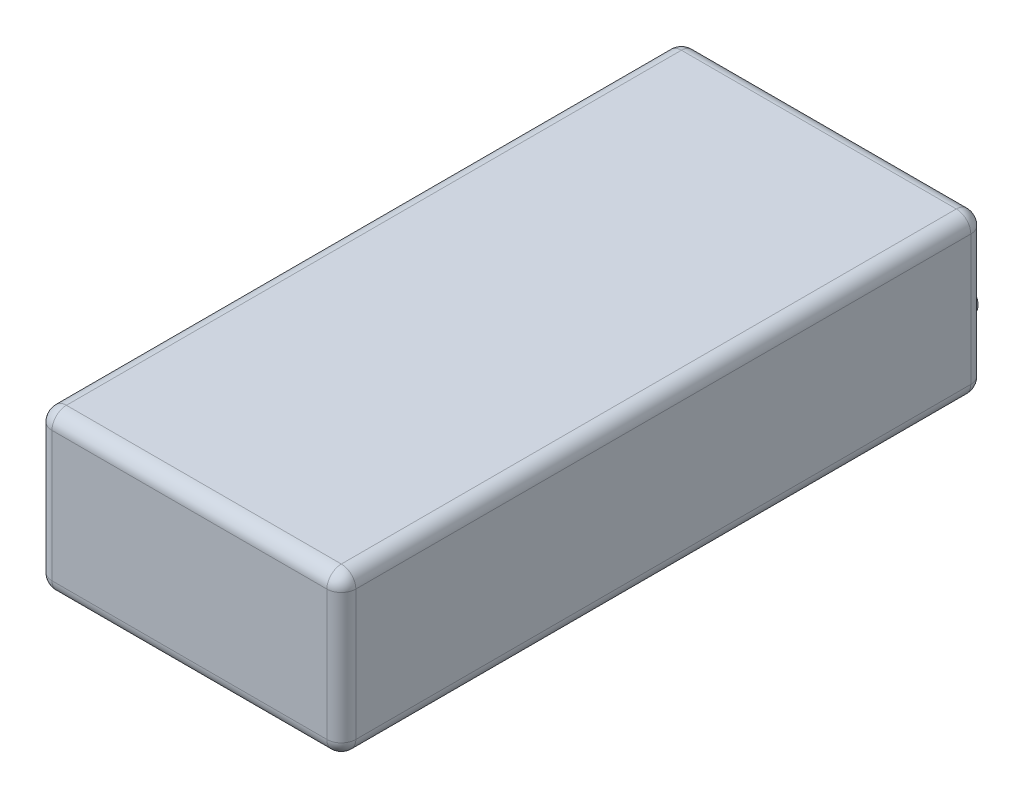
ISO-10303-21;
HEADER;
FILE_DESCRIPTION(('STEP AP214'),'2;1');
FILE_NAME('part.step','',(''),(''),'','','');
FILE_SCHEMA(('AUTOMOTIVE_DESIGN { 1 0 10303 214 1 1 1 1 }'));
ENDSEC;
DATA;
#1=APPLICATION_CONTEXT('core data for automotive mechanical design processes');
#2=APPLICATION_PROTOCOL_DEFINITION('international standard','automotive_design',2000,#1);
#3=PRODUCT_CONTEXT('',#1,'mechanical');
#4=PRODUCT('Part','Part','',(#3));
#5=PRODUCT_RELATED_PRODUCT_CATEGORY('part','',(#4));
#6=PRODUCT_DEFINITION_FORMATION('','',#4);
#7=PRODUCT_DEFINITION_CONTEXT('part definition',#1,'design');
#8=PRODUCT_DEFINITION('design','',#6,#7);
#9=PRODUCT_DEFINITION_SHAPE('','',#8);
#10=(LENGTH_UNIT() NAMED_UNIT(*) SI_UNIT(.MILLI.,.METRE.));
#11=(NAMED_UNIT(*) PLANE_ANGLE_UNIT() SI_UNIT($,.RADIAN.));
#12=(NAMED_UNIT(*) SI_UNIT($,.STERADIAN.) SOLID_ANGLE_UNIT());
#13=UNCERTAINTY_MEASURE_WITH_UNIT(LENGTH_MEASURE(1.E-05),#10,'distance_accuracy_value','');
#14=(GEOMETRIC_REPRESENTATION_CONTEXT(3) GLOBAL_UNCERTAINTY_ASSIGNED_CONTEXT((#13)) GLOBAL_UNIT_ASSIGNED_CONTEXT((#10,
#11,#12)) REPRESENTATION_CONTEXT('',''));
#15=CARTESIAN_POINT('',(0.,0.,0.));
#16=DIRECTION('',(0.,0.,1.));
#17=DIRECTION('',(1.,0.,0.));
#18=AXIS2_PLACEMENT_3D('',#15,#16,#17);
#19=CARTESIAN_POINT('',(-21.,-11.,-44.5));
#20=DIRECTION('',(0.,0.,-1.));
#21=DIRECTION('',(-1.,0.,0.));
#22=AXIS2_PLACEMENT_3D('',#19,#20,#21);
#23=PLANE('',#22);
#24=DIRECTION('',(0.,1.,0.));
#25=VECTOR('',#24,1.);
#26=CARTESIAN_POINT('',(-19.,-11.,-44.5));
#27=LINE('',#26,#25);
#28=CARTESIAN_POINT('',(-19.,-9.,-44.5));
#29=VERTEX_POINT('',#28);
#30=CARTESIAN_POINT('',(-19.,9.,-44.5));
#31=VERTEX_POINT('',#30);
#32=EDGE_CURVE('E205',#29,#31,#27,.T.);
#33=ORIENTED_EDGE('',*,*,#32,.T.);
#34=DIRECTION('',(-1.,0.,0.));
#35=VECTOR('',#34,1.);
#36=CARTESIAN_POINT('',(21.,9.,-44.5));
#37=LINE('',#36,#35);
#38=CARTESIAN_POINT('',(19.,9.,-44.5));
#39=VERTEX_POINT('',#38);
#40=EDGE_CURVE('E208',#31,#39,#37,.F.);
#41=ORIENTED_EDGE('',*,*,#40,.T.);
#42=DIRECTION('',(0.,1.,0.));
#43=VECTOR('',#42,1.);
#44=CARTESIAN_POINT('',(19.,-11.,-44.5));
#45=LINE('',#44,#43);
#46=CARTESIAN_POINT('',(19.,-9.,-44.5));
#47=VERTEX_POINT('',#46);
#48=EDGE_CURVE('E203',#39,#47,#45,.F.);
#49=ORIENTED_EDGE('',*,*,#48,.T.);
#50=DIRECTION('',(-1.,0.,0.));
#51=VECTOR('',#50,1.);
#52=CARTESIAN_POINT('',(-21.,-9.,-44.5));
#53=LINE('',#52,#51);
#54=EDGE_CURVE('E201',#47,#29,#53,.T.);
#55=ORIENTED_EDGE('',*,*,#54,.T.);
#56=EDGE_LOOP('',(#33,#41,#49,#55));
#57=FACE_BOUND('',#56,.T.);
#58=CARTESIAN_POINT('',(13.,-6.,-44.5));
#59=DIRECTION('',(0.,0.,-1.));
#60=DIRECTION('',(-1.,0.,0.));
#61=AXIS2_PLACEMENT_3D('',#58,#59,#60);
#62=CIRCLE('',#61,2.);
#63=CARTESIAN_POINT('',(11.,-6.,-44.5));
#64=VERTEX_POINT('',#63);
#65=EDGE_CURVE('E317',#64,#64,#62,.T.);
#66=ORIENTED_EDGE('',*,*,#65,.F.);
#67=EDGE_LOOP('',(#66));
#68=FACE_BOUND('',#67,.T.);
#69=DIRECTION('',(1.,0.,0.));
#70=VECTOR('',#69,1.);
#71=CARTESIAN_POINT('',(-5.5,3.5,-44.5));
#72=LINE('',#71,#70);
#73=CARTESIAN_POINT('',(-12.5,3.5,-44.5));
#74=VERTEX_POINT('',#73);
#75=CARTESIAN_POINT('',(-5.5,3.5,-44.5));
#76=VERTEX_POINT('',#75);
#77=EDGE_CURVE('E331',#74,#76,#72,.T.);
#78=ORIENTED_EDGE('',*,*,#77,.F.);
#79=DIRECTION('',(0.,1.,0.));
#80=VECTOR('',#79,1.);
#81=CARTESIAN_POINT('',(-12.5,-1.5,-44.5));
#82=LINE('',#81,#80);
#83=CARTESIAN_POINT('',(-12.5,-1.5,-44.5));
#84=VERTEX_POINT('',#83);
#85=EDGE_CURVE('E176',#84,#74,#82,.T.);
#86=ORIENTED_EDGE('',*,*,#85,.F.);
#87=DIRECTION('',(-1.,0.,0.));
#88=VECTOR('',#87,1.);
#89=CARTESIAN_POINT('',(-5.5,-1.5,-44.5));
#90=LINE('',#89,#88);
#91=CARTESIAN_POINT('',(-5.5,-1.5,-44.5));
#92=VERTEX_POINT('',#91);
#93=EDGE_CURVE('E172',#92,#84,#90,.T.);
#94=ORIENTED_EDGE('',*,*,#93,.F.);
#95=DIRECTION('',(0.,-1.,0.));
#96=VECTOR('',#95,1.);
#97=CARTESIAN_POINT('',(-5.5,-1.5,-44.5));
#98=LINE('',#97,#96);
#99=EDGE_CURVE('E333',#76,#92,#98,.T.);
#100=ORIENTED_EDGE('',*,*,#99,.F.);
#101=EDGE_LOOP('',(#78,#86,#94,#100));
#102=FACE_BOUND('',#101,.T.);
#103=ADVANCED_FACE('F41',(#57,#68,#102),#23,.T.);
#104=CARTESIAN_POINT('',(21.,-11.,44.5));
#105=DIRECTION('',(1.,0.,0.));
#106=DIRECTION('',(0.,0.,-1.));
#107=AXIS2_PLACEMENT_3D('',#104,#105,#106);
#108=PLANE('',#107);
#109=DIRECTION('',(0.,1.,0.));
#110=VECTOR('',#109,1.);
#111=CARTESIAN_POINT('',(21.,-11.,42.5));
#112=LINE('',#111,#110);
#113=CARTESIAN_POINT('',(21.,9.,42.5));
#114=VERTEX_POINT('',#113);
#115=CARTESIAN_POINT('',(21.,-9.,42.5));
#116=VERTEX_POINT('',#115);
#117=EDGE_CURVE('E212',#114,#116,#112,.F.);
#118=ORIENTED_EDGE('',*,*,#117,.T.);
#119=DIRECTION('',(0.,0.,-1.));
#120=VECTOR('',#119,1.);
#121=CARTESIAN_POINT('',(21.,-9.,44.5));
#122=LINE('',#121,#120);
#123=CARTESIAN_POINT('',(21.,-9.,-42.5));
#124=VERTEX_POINT('',#123);
#125=EDGE_CURVE('E216',#116,#124,#122,.T.);
#126=ORIENTED_EDGE('',*,*,#125,.T.);
#127=DIRECTION('',(0.,1.,0.));
#128=VECTOR('',#127,1.);
#129=CARTESIAN_POINT('',(21.,-11.,-42.5));
#130=LINE('',#129,#128);
#131=CARTESIAN_POINT('',(21.,9.,-42.5));
#132=VERTEX_POINT('',#131);
#133=EDGE_CURVE('E214',#124,#132,#130,.T.);
#134=ORIENTED_EDGE('',*,*,#133,.T.);
#135=DIRECTION('',(0.,0.,-1.));
#136=VECTOR('',#135,1.);
#137=CARTESIAN_POINT('',(21.,9.,44.5));
#138=LINE('',#137,#136);
#139=EDGE_CURVE('E210',#132,#114,#138,.F.);
#140=ORIENTED_EDGE('',*,*,#139,.T.);
#141=EDGE_LOOP('',(#118,#126,#134,#140));
#142=FACE_BOUND('',#141,.T.);
#143=ADVANCED_FACE('F346',(#142),#108,.T.);
#144=CARTESIAN_POINT('',(-21.,-11.,44.5));
#145=DIRECTION('',(0.,0.,1.));
#146=DIRECTION('',(1.,0.,0.));
#147=AXIS2_PLACEMENT_3D('',#144,#145,#146);
#148=PLANE('',#147);
#149=DIRECTION('',(0.,1.,0.));
#150=VECTOR('',#149,1.);
#151=CARTESIAN_POINT('',(-19.,-11.,44.5));
#152=LINE('',#151,#150);
#153=CARTESIAN_POINT('',(-19.,9.,44.5));
#154=VERTEX_POINT('',#153);
#155=CARTESIAN_POINT('',(-19.,-9.,44.5));
#156=VERTEX_POINT('',#155);
#157=EDGE_CURVE('E223',#154,#156,#152,.F.);
#158=ORIENTED_EDGE('',*,*,#157,.T.);
#159=DIRECTION('',(1.,0.,0.));
#160=VECTOR('',#159,1.);
#161=CARTESIAN_POINT('',(-21.,-9.,44.5));
#162=LINE('',#161,#160);
#163=CARTESIAN_POINT('',(19.,-9.,44.5));
#164=VERTEX_POINT('',#163);
#165=EDGE_CURVE('E225',#156,#164,#162,.T.);
#166=ORIENTED_EDGE('',*,*,#165,.T.);
#167=DIRECTION('',(0.,1.,0.));
#168=VECTOR('',#167,1.);
#169=CARTESIAN_POINT('',(19.,-11.,44.5));
#170=LINE('',#169,#168);
#171=CARTESIAN_POINT('',(19.,9.,44.5));
#172=VERTEX_POINT('',#171);
#173=EDGE_CURVE('E221',#164,#172,#170,.T.);
#174=ORIENTED_EDGE('',*,*,#173,.T.);
#175=DIRECTION('',(1.,0.,0.));
#176=VECTOR('',#175,1.);
#177=CARTESIAN_POINT('',(-21.,9.,44.5));
#178=LINE('',#177,#176);
#179=EDGE_CURVE('E219',#172,#154,#178,.F.);
#180=ORIENTED_EDGE('',*,*,#179,.T.);
#181=EDGE_LOOP('',(#158,#166,#174,#180));
#182=FACE_BOUND('',#181,.T.);
#183=ADVANCED_FACE('F352',(#182),#148,.T.);
#184=CARTESIAN_POINT('',(-21.,-11.,44.5));
#185=DIRECTION('',(-1.,0.,0.));
#186=DIRECTION('',(0.,0.,1.));
#187=AXIS2_PLACEMENT_3D('',#184,#185,#186);
#188=PLANE('',#187);
#189=DIRECTION('',(0.,1.,0.));
#190=VECTOR('',#189,1.);
#191=CARTESIAN_POINT('',(-21.,-11.,-42.5));
#192=LINE('',#191,#190);
#193=CARTESIAN_POINT('',(-21.,9.,-42.5));
#194=VERTEX_POINT('',#193);
#195=CARTESIAN_POINT('',(-21.,-9.,-42.5));
#196=VERTEX_POINT('',#195);
#197=EDGE_CURVE('E187',#194,#196,#192,.F.);
#198=ORIENTED_EDGE('',*,*,#197,.T.);
#199=DIRECTION('',(0.,0.,1.));
#200=VECTOR('',#199,1.);
#201=CARTESIAN_POINT('',(-21.,-9.,44.5));
#202=LINE('',#201,#200);
#203=CARTESIAN_POINT('',(-21.,-9.,42.5));
#204=VERTEX_POINT('',#203);
#205=EDGE_CURVE('E189',#196,#204,#202,.T.);
#206=ORIENTED_EDGE('',*,*,#205,.T.);
#207=DIRECTION('',(0.,1.,0.));
#208=VECTOR('',#207,1.);
#209=CARTESIAN_POINT('',(-21.,-11.,42.5));
#210=LINE('',#209,#208);
#211=CARTESIAN_POINT('',(-21.,9.,42.5));
#212=VERTEX_POINT('',#211);
#213=EDGE_CURVE('E180',#204,#212,#210,.T.);
#214=ORIENTED_EDGE('',*,*,#213,.T.);
#215=DIRECTION('',(0.,0.,1.));
#216=VECTOR('',#215,1.);
#217=CARTESIAN_POINT('',(-21.,9.,-44.5));
#218=LINE('',#217,#216);
#219=EDGE_CURVE('E178',#212,#194,#218,.F.);
#220=ORIENTED_EDGE('',*,*,#219,.T.);
#221=EDGE_LOOP('',(#198,#206,#214,#220));
#222=FACE_BOUND('',#221,.T.);
#223=ADVANCED_FACE('F357',(#222),#188,.T.);
#224=CARTESIAN_POINT('',(0.,-11.,0.));
#225=DIRECTION('',(0.,-1.,0.));
#226=DIRECTION('',(0.,0.,-1.));
#227=AXIS2_PLACEMENT_3D('',#224,#225,#226);
#228=PLANE('',#227);
#229=DIRECTION('',(0.,0.,-1.));
#230=VECTOR('',#229,1.);
#231=CARTESIAN_POINT('',(19.,-11.,0.));
#232=LINE('',#231,#230);
#233=CARTESIAN_POINT('',(19.,-11.,-42.5));
#234=VERTEX_POINT('',#233);
#235=CARTESIAN_POINT('',(19.,-11.,42.5));
#236=VERTEX_POINT('',#235);
#237=EDGE_CURVE('E194',#234,#236,#232,.F.);
#238=ORIENTED_EDGE('',*,*,#237,.T.);
#239=DIRECTION('',(1.,0.,0.));
#240=VECTOR('',#239,1.);
#241=CARTESIAN_POINT('',(0.,-11.,42.5));
#242=LINE('',#241,#240);
#243=CARTESIAN_POINT('',(-19.,-11.,42.5));
#244=VERTEX_POINT('',#243);
#245=EDGE_CURVE('E199',#236,#244,#242,.F.);
#246=ORIENTED_EDGE('',*,*,#245,.T.);
#247=DIRECTION('',(0.,0.,1.));
#248=VECTOR('',#247,1.);
#249=CARTESIAN_POINT('',(-19.,-11.,0.));
#250=LINE('',#249,#248);
#251=CARTESIAN_POINT('',(-19.,-11.,-42.5));
#252=VERTEX_POINT('',#251);
#253=EDGE_CURVE('E196',#244,#252,#250,.F.);
#254=ORIENTED_EDGE('',*,*,#253,.T.);
#255=DIRECTION('',(-1.,0.,0.));
#256=VECTOR('',#255,1.);
#257=CARTESIAN_POINT('',(0.,-11.,-42.5));
#258=LINE('',#257,#256);
#259=EDGE_CURVE('E192',#252,#234,#258,.F.);
#260=ORIENTED_EDGE('',*,*,#259,.T.);
#261=EDGE_LOOP('',(#238,#246,#254,#260));
#262=FACE_BOUND('',#261,.T.);
#263=CARTESIAN_POINT('',(-12.,-11.,25.5));
#264=DIRECTION('',(0.,-1.,0.));
#265=DIRECTION('',(0.,0.,-1.));
#266=AXIS2_PLACEMENT_3D('',#263,#264,#265);
#267=CIRCLE('',#266,2.5);
#268=CARTESIAN_POINT('',(-12.,-11.,23.));
#269=VERTEX_POINT('',#268);
#270=EDGE_CURVE('E486',#269,#269,#267,.T.);
#271=ORIENTED_EDGE('',*,*,#270,.F.);
#272=EDGE_LOOP('',(#271));
#273=FACE_BOUND('',#272,.T.);
#274=CARTESIAN_POINT('',(12.,-11.,-14.5));
#275=DIRECTION('',(0.,-1.,0.));
#276=DIRECTION('',(0.,0.,-1.));
#277=AXIS2_PLACEMENT_3D('',#274,#275,#276);
#278=CIRCLE('',#277,2.5);
#279=CARTESIAN_POINT('',(12.,-11.,-17.));
#280=VERTEX_POINT('',#279);
#281=EDGE_CURVE('E310',#280,#280,#278,.T.);
#282=ORIENTED_EDGE('',*,*,#281,.F.);
#283=EDGE_LOOP('',(#282));
#284=FACE_BOUND('',#283,.T.);
#285=CARTESIAN_POINT('',(-12.,-11.,-14.5));
#286=DIRECTION('',(0.,-1.,0.));
#287=DIRECTION('',(0.,0.,-1.));
#288=AXIS2_PLACEMENT_3D('',#285,#286,#287);
#289=CIRCLE('',#288,2.5);
#290=CARTESIAN_POINT('',(-12.,-11.,-17.));
#291=VERTEX_POINT('',#290);
#292=EDGE_CURVE('E299',#291,#291,#289,.T.);
#293=ORIENTED_EDGE('',*,*,#292,.F.);
#294=EDGE_LOOP('',(#293));
#295=FACE_BOUND('',#294,.T.);
#296=CARTESIAN_POINT('',(12.,-11.,25.5));
#297=DIRECTION('',(0.,-1.,0.));
#298=DIRECTION('',(0.,0.,-1.));
#299=AXIS2_PLACEMENT_3D('',#296,#297,#298);
#300=CIRCLE('',#299,2.5);
#301=CARTESIAN_POINT('',(12.,-11.,23.));
#302=VERTEX_POINT('',#301);
#303=EDGE_CURVE('E318',#302,#302,#300,.T.);
#304=ORIENTED_EDGE('',*,*,#303,.F.);
#305=EDGE_LOOP('',(#304));
#306=FACE_BOUND('',#305,.T.);
#307=ADVANCED_FACE('F479',(#262,#273,#284,#295,#306),#228,.T.);
#308=CARTESIAN_POINT('',(0.,11.,0.));
#309=DIRECTION('',(0.,-1.,0.));
#310=DIRECTION('',(0.,0.,-1.));
#311=AXIS2_PLACEMENT_3D('',#308,#309,#310);
#312=PLANE('',#311);
#313=DIRECTION('',(0.,0.,1.));
#314=VECTOR('',#313,1.);
#315=CARTESIAN_POINT('',(-19.,11.,44.5));
#316=LINE('',#315,#314);
#317=CARTESIAN_POINT('',(-19.,11.,-42.5));
#318=VERTEX_POINT('',#317);
#319=CARTESIAN_POINT('',(-19.,11.,42.5));
#320=VERTEX_POINT('',#319);
#321=EDGE_CURVE('E50',#318,#320,#316,.T.);
#322=ORIENTED_EDGE('',*,*,#321,.T.);
#323=DIRECTION('',(1.,0.,0.));
#324=VECTOR('',#323,1.);
#325=CARTESIAN_POINT('',(21.,11.,42.5));
#326=LINE('',#325,#324);
#327=CARTESIAN_POINT('',(19.,11.,42.5));
#328=VERTEX_POINT('',#327);
#329=EDGE_CURVE('E11',#320,#328,#326,.T.);
#330=ORIENTED_EDGE('',*,*,#329,.T.);
#331=DIRECTION('',(0.,0.,-1.));
#332=VECTOR('',#331,1.);
#333=CARTESIAN_POINT('',(19.,11.,-44.5));
#334=LINE('',#333,#332);
#335=CARTESIAN_POINT('',(19.,11.,-42.5));
#336=VERTEX_POINT('',#335);
#337=EDGE_CURVE('E228',#328,#336,#334,.T.);
#338=ORIENTED_EDGE('',*,*,#337,.T.);
#339=DIRECTION('',(-1.,0.,0.));
#340=VECTOR('',#339,1.);
#341=CARTESIAN_POINT('',(-21.,11.,-42.5));
#342=LINE('',#341,#340);
#343=EDGE_CURVE('E61',#336,#318,#342,.T.);
#344=ORIENTED_EDGE('',*,*,#343,.T.);
#345=EDGE_LOOP('',(#322,#330,#338,#344));
#346=FACE_BOUND('',#345,.T.);
#347=ADVANCED_FACE('F449',(#346),#312,.F.);
#348=CARTESIAN_POINT('',(-12.5,-1.5,-46.5));
#349=DIRECTION('',(1.,0.,0.));
#350=DIRECTION('',(0.,0.,-1.));
#351=AXIS2_PLACEMENT_3D('',#348,#349,#350);
#352=PLANE('',#351);
#353=ORIENTED_EDGE('',*,*,#85,.T.);
#354=DIRECTION('',(0.,0.,1.));
#355=VECTOR('',#354,1.);
#356=CARTESIAN_POINT('',(-12.5,3.5,-46.5));
#357=LINE('',#356,#355);
#358=CARTESIAN_POINT('',(-12.5,3.5,-46.5));
#359=VERTEX_POINT('',#358);
#360=EDGE_CURVE('E156',#359,#74,#357,.T.);
#361=ORIENTED_EDGE('',*,*,#360,.F.);
#362=DIRECTION('',(0.,1.,0.));
#363=VECTOR('',#362,1.);
#364=CARTESIAN_POINT('',(-12.5,-1.5,-46.5));
#365=LINE('',#364,#363);
#366=CARTESIAN_POINT('',(-12.5,-1.5,-46.5));
#367=VERTEX_POINT('',#366);
#368=EDGE_CURVE('E163',#367,#359,#365,.T.);
#369=ORIENTED_EDGE('',*,*,#368,.F.);
#370=DIRECTION('',(0.,0.,1.));
#371=VECTOR('',#370,1.);
#372=CARTESIAN_POINT('',(-12.5,-1.5,-46.5));
#373=LINE('',#372,#371);
#374=EDGE_CURVE('E329',#367,#84,#373,.T.);
#375=ORIENTED_EDGE('',*,*,#374,.T.);
#376=EDGE_LOOP('',(#353,#361,#369,#375));
#377=FACE_BOUND('',#376,.T.);
#378=ADVANCED_FACE('F174',(#377),#352,.F.);
#379=CARTESIAN_POINT('',(-5.5,3.5,-46.5));
#380=DIRECTION('',(0.,-1.,0.));
#381=DIRECTION('',(0.,0.,-1.));
#382=AXIS2_PLACEMENT_3D('',#379,#380,#381);
#383=PLANE('',#382);
#384=ORIENTED_EDGE('',*,*,#77,.T.);
#385=DIRECTION('',(0.,0.,1.));
#386=VECTOR('',#385,1.);
#387=CARTESIAN_POINT('',(-5.5,3.5,-46.5));
#388=LINE('',#387,#386);
#389=CARTESIAN_POINT('',(-5.5,3.5,-46.5));
#390=VERTEX_POINT('',#389);
#391=EDGE_CURVE('E159',#390,#76,#388,.T.);
#392=ORIENTED_EDGE('',*,*,#391,.F.);
#393=DIRECTION('',(1.,0.,0.));
#394=VECTOR('',#393,1.);
#395=CARTESIAN_POINT('',(-5.5,3.5,-46.5));
#396=LINE('',#395,#394);
#397=EDGE_CURVE('E152',#359,#390,#396,.T.);
#398=ORIENTED_EDGE('',*,*,#397,.F.);
#399=ORIENTED_EDGE('',*,*,#360,.T.);
#400=EDGE_LOOP('',(#384,#392,#398,#399));
#401=FACE_BOUND('',#400,.T.);
#402=ADVANCED_FACE('F154',(#401),#383,.F.);
#403=CARTESIAN_POINT('',(-5.5,-1.5,-46.5));
#404=DIRECTION('',(-1.,0.,0.));
#405=DIRECTION('',(0.,0.,1.));
#406=AXIS2_PLACEMENT_3D('',#403,#404,#405);
#407=PLANE('',#406);
#408=ORIENTED_EDGE('',*,*,#99,.T.);
#409=DIRECTION('',(0.,0.,1.));
#410=VECTOR('',#409,1.);
#411=CARTESIAN_POINT('',(-5.5,-1.5,-46.5));
#412=LINE('',#411,#410);
#413=CARTESIAN_POINT('',(-5.5,-1.5,-46.5));
#414=VERTEX_POINT('',#413);
#415=EDGE_CURVE('E182',#414,#92,#412,.T.);
#416=ORIENTED_EDGE('',*,*,#415,.F.);
#417=DIRECTION('',(0.,-1.,0.));
#418=VECTOR('',#417,1.);
#419=CARTESIAN_POINT('',(-5.5,-1.5,-46.5));
#420=LINE('',#419,#418);
#421=EDGE_CURVE('E162',#390,#414,#420,.T.);
#422=ORIENTED_EDGE('',*,*,#421,.F.);
#423=ORIENTED_EDGE('',*,*,#391,.T.);
#424=EDGE_LOOP('',(#408,#416,#422,#423));
#425=FACE_BOUND('',#424,.T.);
#426=ADVANCED_FACE('F343',(#425),#407,.F.);
#427=CARTESIAN_POINT('',(-5.5,-1.5,-46.5));
#428=DIRECTION('',(0.,1.,0.));
#429=DIRECTION('',(0.,0.,1.));
#430=AXIS2_PLACEMENT_3D('',#427,#428,#429);
#431=PLANE('',#430);
#432=ORIENTED_EDGE('',*,*,#93,.T.);
#433=ORIENTED_EDGE('',*,*,#374,.F.);
#434=DIRECTION('',(-1.,0.,0.));
#435=VECTOR('',#434,1.);
#436=CARTESIAN_POINT('',(-5.5,-1.5,-46.5));
#437=LINE('',#436,#435);
#438=EDGE_CURVE('E168',#414,#367,#437,.T.);
#439=ORIENTED_EDGE('',*,*,#438,.F.);
#440=ORIENTED_EDGE('',*,*,#415,.T.);
#441=EDGE_LOOP('',(#432,#433,#439,#440));
#442=FACE_BOUND('',#441,.T.);
#443=ADVANCED_FACE('F339',(#442),#431,.F.);
#444=CARTESIAN_POINT('',(0.,0.,-46.5));
#445=DIRECTION('',(0.,0.,1.));
#446=DIRECTION('',(1.,0.,0.));
#447=AXIS2_PLACEMENT_3D('',#444,#445,#446);
#448=PLANE('',#447);
#449=ORIENTED_EDGE('',*,*,#368,.T.);
#450=ORIENTED_EDGE('',*,*,#397,.T.);
#451=ORIENTED_EDGE('',*,*,#421,.T.);
#452=ORIENTED_EDGE('',*,*,#438,.T.);
#453=EDGE_LOOP('',(#449,#450,#451,#452));
#454=FACE_BOUND('',#453,.T.);
#455=ADVANCED_FACE('F166',(#454),#448,.F.);
#456=CARTESIAN_POINT('',(13.,-6.,-49.5));
#457=DIRECTION('',(0.,0.,1.));
#458=DIRECTION('',(1.,0.,0.));
#459=AXIS2_PLACEMENT_3D('',#456,#457,#458);
#460=CYLINDRICAL_SURFACE('',#459,2.);
#461=CARTESIAN_POINT('',(13.,-6.,-49.5));
#462=DIRECTION('',(0.,0.,-1.));
#463=DIRECTION('',(-1.,0.,0.));
#464=AXIS2_PLACEMENT_3D('',#461,#462,#463);
#465=CIRCLE('',#464,2.);
#466=CARTESIAN_POINT('',(11.,-6.,-49.5));
#467=VERTEX_POINT('',#466);
#468=EDGE_CURVE('E322',#467,#467,#465,.T.);
#469=ORIENTED_EDGE('',*,*,#468,.F.);
#470=EDGE_LOOP('',(#469));
#471=FACE_BOUND('',#470,.T.);
#472=ORIENTED_EDGE('',*,*,#65,.T.);
#473=EDGE_LOOP('',(#472));
#474=FACE_BOUND('',#473,.T.);
#475=ADVANCED_FACE('F506',(#471,#474),#460,.T.);
#476=CARTESIAN_POINT('',(13.,-6.,-49.5));
#477=DIRECTION('',(0.,0.,-1.));
#478=DIRECTION('',(-1.,0.,0.));
#479=AXIS2_PLACEMENT_3D('',#476,#477,#478);
#480=PLANE('',#479);
#481=ORIENTED_EDGE('',*,*,#468,.T.);
#482=EDGE_LOOP('',(#481));
#483=FACE_BOUND('',#482,.T.);
#484=ADVANCED_FACE('F496',(#483),#480,.T.);
#485=CARTESIAN_POINT('',(12.,-0.999999999999999,25.5));
#486=DIRECTION('',(0.,-1.,0.));
#487=DIRECTION('',(0.,0.,-1.));
#488=AXIS2_PLACEMENT_3D('',#485,#486,#487);
#489=CYLINDRICAL_SURFACE('',#488,2.5);
#490=CARTESIAN_POINT('',(12.,-0.999999999999999,25.5));
#491=DIRECTION('',(0.,-1.,0.));
#492=DIRECTION('',(0.,0.,-1.));
#493=AXIS2_PLACEMENT_3D('',#490,#491,#492);
#494=CIRCLE('',#493,2.5);
#495=CARTESIAN_POINT('',(12.,-0.999999999999999,23.));
#496=VERTEX_POINT('',#495);
#497=EDGE_CURVE('E314',#496,#496,#494,.T.);
#498=ORIENTED_EDGE('',*,*,#497,.F.);
#499=EDGE_LOOP('',(#498));
#500=FACE_BOUND('',#499,.T.);
#501=ORIENTED_EDGE('',*,*,#303,.T.);
#502=EDGE_LOOP('',(#501));
#503=FACE_BOUND('',#502,.T.);
#504=ADVANCED_FACE('F493',(#500,#503),#489,.F.);
#505=CARTESIAN_POINT('',(12.,-0.999999999999999,25.5));
#506=DIRECTION('',(0.,-1.,0.));
#507=DIRECTION('',(0.,0.,-1.));
#508=AXIS2_PLACEMENT_3D('',#505,#506,#507);
#509=PLANE('',#508);
#510=ORIENTED_EDGE('',*,*,#497,.T.);
#511=EDGE_LOOP('',(#510));
#512=FACE_BOUND('',#511,.T.);
#513=ADVANCED_FACE('F495',(#512),#509,.T.);
#514=CARTESIAN_POINT('',(-12.,-0.999999999999999,-14.5));
#515=DIRECTION('',(0.,-1.,0.));
#516=DIRECTION('',(0.,0.,-1.));
#517=AXIS2_PLACEMENT_3D('',#514,#515,#516);
#518=CYLINDRICAL_SURFACE('',#517,2.5);
#519=CARTESIAN_POINT('',(-12.,-0.999999999999999,-14.5));
#520=DIRECTION('',(0.,-1.,0.));
#521=DIRECTION('',(0.,0.,-1.));
#522=AXIS2_PLACEMENT_3D('',#519,#520,#521);
#523=CIRCLE('',#522,2.5);
#524=CARTESIAN_POINT('',(-12.,-0.999999999999999,-17.));
#525=VERTEX_POINT('',#524);
#526=EDGE_CURVE('E305',#525,#525,#523,.T.);
#527=ORIENTED_EDGE('',*,*,#526,.F.);
#528=EDGE_LOOP('',(#527));
#529=FACE_BOUND('',#528,.T.);
#530=ORIENTED_EDGE('',*,*,#292,.T.);
#531=EDGE_LOOP('',(#530));
#532=FACE_BOUND('',#531,.T.);
#533=ADVANCED_FACE('F503',(#529,#532),#518,.F.);
#534=CARTESIAN_POINT('',(-12.,-0.999999999999999,-14.5));
#535=DIRECTION('',(0.,-1.,0.));
#536=DIRECTION('',(0.,0.,-1.));
#537=AXIS2_PLACEMENT_3D('',#534,#535,#536);
#538=PLANE('',#537);
#539=ORIENTED_EDGE('',*,*,#526,.T.);
#540=EDGE_LOOP('',(#539));
#541=FACE_BOUND('',#540,.T.);
#542=ADVANCED_FACE('F588',(#541),#538,.T.);
#543=CARTESIAN_POINT('',(12.,-0.999999999999999,-14.5));
#544=DIRECTION('',(0.,-1.,0.));
#545=DIRECTION('',(0.,0.,-1.));
#546=AXIS2_PLACEMENT_3D('',#543,#544,#545);
#547=CYLINDRICAL_SURFACE('',#546,2.5);
#548=CARTESIAN_POINT('',(12.,-0.999999999999999,-14.5));
#549=DIRECTION('',(0.,-1.,0.));
#550=DIRECTION('',(0.,0.,-1.));
#551=AXIS2_PLACEMENT_3D('',#548,#549,#550);
#552=CIRCLE('',#551,2.5);
#553=CARTESIAN_POINT('',(12.,-0.999999999999999,-17.));
#554=VERTEX_POINT('',#553);
#555=EDGE_CURVE('E792',#554,#554,#552,.T.);
#556=ORIENTED_EDGE('',*,*,#555,.F.);
#557=EDGE_LOOP('',(#556));
#558=FACE_BOUND('',#557,.T.);
#559=ORIENTED_EDGE('',*,*,#281,.T.);
#560=EDGE_LOOP('',(#559));
#561=FACE_BOUND('',#560,.T.);
#562=ADVANCED_FACE('F597',(#558,#561),#547,.F.);
#563=CARTESIAN_POINT('',(12.,-0.999999999999999,-14.5));
#564=DIRECTION('',(0.,-1.,0.));
#565=DIRECTION('',(0.,0.,-1.));
#566=AXIS2_PLACEMENT_3D('',#563,#564,#565);
#567=PLANE('',#566);
#568=ORIENTED_EDGE('',*,*,#555,.T.);
#569=EDGE_LOOP('',(#568));
#570=FACE_BOUND('',#569,.T.);
#571=ADVANCED_FACE('F607',(#570),#567,.T.);
#572=CARTESIAN_POINT('',(-12.,-0.999999999999999,25.5));
#573=DIRECTION('',(0.,-1.,0.));
#574=DIRECTION('',(0.,0.,-1.));
#575=AXIS2_PLACEMENT_3D('',#572,#573,#574);
#576=CYLINDRICAL_SURFACE('',#575,2.5);
#577=CARTESIAN_POINT('',(-12.,-0.999999999999999,25.5));
#578=DIRECTION('',(0.,-1.,0.));
#579=DIRECTION('',(0.,0.,-1.));
#580=AXIS2_PLACEMENT_3D('',#577,#578,#579);
#581=CIRCLE('',#580,2.5);
#582=CARTESIAN_POINT('',(-12.,-0.999999999999999,23.));
#583=VERTEX_POINT('',#582);
#584=EDGE_CURVE('E321',#583,#583,#581,.T.);
#585=ORIENTED_EDGE('',*,*,#584,.F.);
#586=EDGE_LOOP('',(#585));
#587=FACE_BOUND('',#586,.T.);
#588=ORIENTED_EDGE('',*,*,#270,.T.);
#589=EDGE_LOOP('',(#588));
#590=FACE_BOUND('',#589,.T.);
#591=ADVANCED_FACE('F617',(#587,#590),#576,.F.);
#592=CARTESIAN_POINT('',(-12.,-0.999999999999999,25.5));
#593=DIRECTION('',(0.,-1.,0.));
#594=DIRECTION('',(0.,0.,-1.));
#595=AXIS2_PLACEMENT_3D('',#592,#593,#594);
#596=PLANE('',#595);
#597=ORIENTED_EDGE('',*,*,#584,.T.);
#598=EDGE_LOOP('',(#597));
#599=FACE_BOUND('',#598,.T.);
#600=ADVANCED_FACE('F435',(#599),#596,.T.);
#601=CARTESIAN_POINT('',(19.,9.,0.));
#602=DIRECTION('',(0.,0.,1.));
#603=DIRECTION('',(1.,0.,0.));
#604=AXIS2_PLACEMENT_3D('',#601,#602,#603);
#605=CYLINDRICAL_SURFACE('',#604,2.);
#606=CARTESIAN_POINT('',(19.,9.,-42.5));
#607=DIRECTION('',(0.,0.,-1.));
#608=DIRECTION('',(-1.,0.,0.));
#609=AXIS2_PLACEMENT_3D('',#606,#607,#608);
#610=CIRCLE('',#609,2.);
#611=EDGE_CURVE('E45',#336,#132,#610,.T.);
#612=ORIENTED_EDGE('',*,*,#611,.F.);
#613=ORIENTED_EDGE('',*,*,#337,.F.);
#614=CARTESIAN_POINT('',(19.,9.,42.5));
#615=DIRECTION('',(0.,0.,1.));
#616=DIRECTION('',(1.,0.,0.));
#617=AXIS2_PLACEMENT_3D('',#614,#615,#616);
#618=CIRCLE('',#617,2.);
#619=EDGE_CURVE('E291',#114,#328,#618,.T.);
#620=ORIENTED_EDGE('',*,*,#619,.F.);
#621=ORIENTED_EDGE('',*,*,#139,.F.);
#622=EDGE_LOOP('',(#612,#613,#620,#621));
#623=FACE_BOUND('',#622,.T.);
#624=ADVANCED_FACE('F43',(#623),#605,.T.);
#625=CARTESIAN_POINT('',(19.,9.,-42.5));
#626=DIRECTION('',(0.,0.,1.));
#627=DIRECTION('',(1.,0.,0.));
#628=AXIS2_PLACEMENT_3D('',#625,#626,#627);
#629=SPHERICAL_SURFACE('',#628,2.);
#630=CARTESIAN_POINT('',(19.,9.,-42.5));
#631=DIRECTION('',(1.,0.,0.));
#632=DIRECTION('',(0.,0.,-1.));
#633=AXIS2_PLACEMENT_3D('',#630,#631,#632);
#634=CIRCLE('',#633,2.);
#635=EDGE_CURVE('E286',#336,#39,#634,.F.);
#636=ORIENTED_EDGE('',*,*,#635,.F.);
#637=ORIENTED_EDGE('',*,*,#611,.T.);
#638=CARTESIAN_POINT('',(19.,9.,-42.5));
#639=DIRECTION('',(0.,1.,0.));
#640=DIRECTION('',(0.,0.,1.));
#641=AXIS2_PLACEMENT_3D('',#638,#639,#640);
#642=CIRCLE('',#641,2.);
#643=EDGE_CURVE('E289',#39,#132,#642,.F.);
#644=ORIENTED_EDGE('',*,*,#643,.F.);
#645=EDGE_LOOP('',(#636,#637,#644));
#646=FACE_BOUND('',#645,.T.);
#647=ADVANCED_FACE('F430',(#646),#629,.T.);
#648=CARTESIAN_POINT('',(19.,9.,42.5));
#649=DIRECTION('',(0.,0.,1.));
#650=DIRECTION('',(1.,0.,0.));
#651=AXIS2_PLACEMENT_3D('',#648,#649,#650);
#652=SPHERICAL_SURFACE('',#651,2.);
#653=CARTESIAN_POINT('',(19.,9.,42.5));
#654=DIRECTION('',(0.,1.,0.));
#655=DIRECTION('',(0.,0.,1.));
#656=AXIS2_PLACEMENT_3D('',#653,#654,#655);
#657=CIRCLE('',#656,2.);
#658=EDGE_CURVE('E281',#114,#172,#657,.F.);
#659=ORIENTED_EDGE('',*,*,#658,.F.);
#660=ORIENTED_EDGE('',*,*,#619,.T.);
#661=CARTESIAN_POINT('',(19.,9.,42.5));
#662=DIRECTION('',(1.,0.,0.));
#663=DIRECTION('',(0.,0.,-1.));
#664=AXIS2_PLACEMENT_3D('',#661,#662,#663);
#665=CIRCLE('',#664,2.);
#666=EDGE_CURVE('E284',#172,#328,#665,.F.);
#667=ORIENTED_EDGE('',*,*,#666,.F.);
#668=EDGE_LOOP('',(#659,#660,#667));
#669=FACE_BOUND('',#668,.T.);
#670=ADVANCED_FACE('F427',(#669),#652,.T.);
#671=CARTESIAN_POINT('',(19.,-11.,-42.5));
#672=DIRECTION('',(0.,1.,0.));
#673=DIRECTION('',(0.,0.,1.));
#674=AXIS2_PLACEMENT_3D('',#671,#672,#673);
#675=CYLINDRICAL_SURFACE('',#674,2.);
#676=ORIENTED_EDGE('',*,*,#643,.T.);
#677=ORIENTED_EDGE('',*,*,#133,.F.);
#678=CARTESIAN_POINT('',(19.,-9.,-42.5));
#679=DIRECTION('',(0.,-1.,0.));
#680=DIRECTION('',(0.,0.,-1.));
#681=AXIS2_PLACEMENT_3D('',#678,#679,#680);
#682=CIRCLE('',#681,2.);
#683=EDGE_CURVE('E276',#47,#124,#682,.T.);
#684=ORIENTED_EDGE('',*,*,#683,.F.);
#685=ORIENTED_EDGE('',*,*,#48,.F.);
#686=EDGE_LOOP('',(#676,#677,#684,#685));
#687=FACE_BOUND('',#686,.T.);
#688=ADVANCED_FACE('F423',(#687),#675,.T.);
#689=CARTESIAN_POINT('',(0.,9.,-42.5));
#690=DIRECTION('',(1.,0.,0.));
#691=DIRECTION('',(0.,0.,-1.));
#692=AXIS2_PLACEMENT_3D('',#689,#690,#691);
#693=CYLINDRICAL_SURFACE('',#692,2.);
#694=ORIENTED_EDGE('',*,*,#635,.T.);
#695=ORIENTED_EDGE('',*,*,#40,.F.);
#696=CARTESIAN_POINT('',(-19.,9.,-42.5));
#697=DIRECTION('',(-1.,0.,0.));
#698=DIRECTION('',(0.,0.,1.));
#699=AXIS2_PLACEMENT_3D('',#696,#697,#698);
#700=CIRCLE('',#699,2.);
#701=EDGE_CURVE('E273',#318,#31,#700,.T.);
#702=ORIENTED_EDGE('',*,*,#701,.F.);
#703=ORIENTED_EDGE('',*,*,#343,.F.);
#704=EDGE_LOOP('',(#694,#695,#702,#703));
#705=FACE_BOUND('',#704,.T.);
#706=ADVANCED_FACE('F419',(#705),#693,.T.);
#707=CARTESIAN_POINT('',(-19.,9.,0.));
#708=DIRECTION('',(0.,0.,-1.));
#709=DIRECTION('',(-1.,0.,0.));
#710=AXIS2_PLACEMENT_3D('',#707,#708,#709);
#711=CYLINDRICAL_SURFACE('',#710,2.);
#712=CARTESIAN_POINT('',(-19.,9.,42.5));
#713=DIRECTION('',(0.,0.,1.));
#714=DIRECTION('',(1.,0.,0.));
#715=AXIS2_PLACEMENT_3D('',#712,#713,#714);
#716=CIRCLE('',#715,2.);
#717=EDGE_CURVE('E267',#320,#212,#716,.T.);
#718=ORIENTED_EDGE('',*,*,#717,.F.);
#719=ORIENTED_EDGE('',*,*,#321,.F.);
#720=CARTESIAN_POINT('',(-19.,9.,-42.5));
#721=DIRECTION('',(0.,0.,-1.));
#722=DIRECTION('',(-1.,0.,0.));
#723=AXIS2_PLACEMENT_3D('',#720,#721,#722);
#724=CIRCLE('',#723,2.);
#725=EDGE_CURVE('E270',#194,#318,#724,.T.);
#726=ORIENTED_EDGE('',*,*,#725,.F.);
#727=ORIENTED_EDGE('',*,*,#219,.F.);
#728=EDGE_LOOP('',(#718,#719,#726,#727));
#729=FACE_BOUND('',#728,.T.);
#730=ADVANCED_FACE('F415',(#729),#711,.T.);
#731=CARTESIAN_POINT('',(0.,9.,42.5));
#732=DIRECTION('',(-1.,0.,0.));
#733=DIRECTION('',(0.,0.,1.));
#734=AXIS2_PLACEMENT_3D('',#731,#732,#733);
#735=CYLINDRICAL_SURFACE('',#734,2.);
#736=ORIENTED_EDGE('',*,*,#666,.T.);
#737=ORIENTED_EDGE('',*,*,#329,.F.);
#738=CARTESIAN_POINT('',(-19.,9.,42.5));
#739=DIRECTION('',(-1.,0.,0.));
#740=DIRECTION('',(0.,0.,1.));
#741=AXIS2_PLACEMENT_3D('',#738,#739,#740);
#742=CIRCLE('',#741,2.);
#743=EDGE_CURVE('E264',#154,#320,#742,.T.);
#744=ORIENTED_EDGE('',*,*,#743,.F.);
#745=ORIENTED_EDGE('',*,*,#179,.F.);
#746=EDGE_LOOP('',(#736,#737,#744,#745));
#747=FACE_BOUND('',#746,.T.);
#748=ADVANCED_FACE('F411',(#747),#735,.T.);
#749=CARTESIAN_POINT('',(19.,-11.,42.5));
#750=DIRECTION('',(0.,1.,0.));
#751=DIRECTION('',(0.,0.,1.));
#752=AXIS2_PLACEMENT_3D('',#749,#750,#751);
#753=CYLINDRICAL_SURFACE('',#752,2.);
#754=ORIENTED_EDGE('',*,*,#658,.T.);
#755=ORIENTED_EDGE('',*,*,#173,.F.);
#756=CARTESIAN_POINT('',(19.,-9.,42.5));
#757=DIRECTION('',(0.,-1.,0.));
#758=DIRECTION('',(0.,0.,-1.));
#759=AXIS2_PLACEMENT_3D('',#756,#757,#758);
#760=CIRCLE('',#759,2.);
#761=EDGE_CURVE('E261',#116,#164,#760,.T.);
#762=ORIENTED_EDGE('',*,*,#761,.F.);
#763=ORIENTED_EDGE('',*,*,#117,.F.);
#764=EDGE_LOOP('',(#754,#755,#762,#763));
#765=FACE_BOUND('',#764,.T.);
#766=ADVANCED_FACE('F407',(#765),#753,.T.);
#767=CARTESIAN_POINT('',(19.,-9.,44.5));
#768=DIRECTION('',(0.,0.,-1.));
#769=DIRECTION('',(-1.,0.,0.));
#770=AXIS2_PLACEMENT_3D('',#767,#768,#769);
#771=CYLINDRICAL_SURFACE('',#770,2.);
#772=CARTESIAN_POINT('',(19.,-9.,-42.5));
#773=DIRECTION('',(0.,0.,-1.));
#774=DIRECTION('',(-1.,0.,0.));
#775=AXIS2_PLACEMENT_3D('',#772,#773,#774);
#776=CIRCLE('',#775,2.);
#777=EDGE_CURVE('E278',#124,#234,#776,.T.);
#778=ORIENTED_EDGE('',*,*,#777,.F.);
#779=ORIENTED_EDGE('',*,*,#125,.F.);
#780=CARTESIAN_POINT('',(19.,-9.,42.5));
#781=DIRECTION('',(0.,0.,1.));
#782=DIRECTION('',(1.,0.,0.));
#783=AXIS2_PLACEMENT_3D('',#780,#781,#782);
#784=CIRCLE('',#783,2.);
#785=EDGE_CURVE('E258',#236,#116,#784,.T.);
#786=ORIENTED_EDGE('',*,*,#785,.F.);
#787=ORIENTED_EDGE('',*,*,#237,.F.);
#788=EDGE_LOOP('',(#778,#779,#786,#787));
#789=FACE_BOUND('',#788,.T.);
#790=ADVANCED_FACE('F403',(#789),#771,.T.);
#791=CARTESIAN_POINT('',(19.,-9.,-42.5));
#792=DIRECTION('',(0.,0.,1.));
#793=DIRECTION('',(1.,0.,0.));
#794=AXIS2_PLACEMENT_3D('',#791,#792,#793);
#795=SPHERICAL_SURFACE('',#794,2.);
#796=ORIENTED_EDGE('',*,*,#683,.T.);
#797=ORIENTED_EDGE('',*,*,#777,.T.);
#798=CARTESIAN_POINT('',(19.,-9.,-42.5));
#799=DIRECTION('',(1.,0.,0.));
#800=DIRECTION('',(0.,0.,-1.));
#801=AXIS2_PLACEMENT_3D('',#798,#799,#800);
#802=CIRCLE('',#801,2.);
#803=EDGE_CURVE('E255',#47,#234,#802,.F.);
#804=ORIENTED_EDGE('',*,*,#803,.F.);
#805=EDGE_LOOP('',(#796,#797,#804));
#806=FACE_BOUND('',#805,.T.);
#807=ADVANCED_FACE('F399',(#806),#795,.T.);
#808=CARTESIAN_POINT('',(-19.,9.,-42.5));
#809=DIRECTION('',(0.,0.,1.));
#810=DIRECTION('',(1.,0.,0.));
#811=AXIS2_PLACEMENT_3D('',#808,#809,#810);
#812=SPHERICAL_SURFACE('',#811,2.);
#813=ORIENTED_EDGE('',*,*,#725,.T.);
#814=ORIENTED_EDGE('',*,*,#701,.T.);
#815=CARTESIAN_POINT('',(-19.,9.,-42.5));
#816=DIRECTION('',(0.,1.,0.));
#817=DIRECTION('',(0.,0.,1.));
#818=AXIS2_PLACEMENT_3D('',#815,#816,#817);
#819=CIRCLE('',#818,2.);
#820=EDGE_CURVE('E253',#194,#31,#819,.F.);
#821=ORIENTED_EDGE('',*,*,#820,.F.);
#822=EDGE_LOOP('',(#813,#814,#821));
#823=FACE_BOUND('',#822,.T.);
#824=ADVANCED_FACE('F395',(#823),#812,.T.);
#825=CARTESIAN_POINT('',(-19.,9.,42.5));
#826=DIRECTION('',(0.,0.,1.));
#827=DIRECTION('',(1.,0.,0.));
#828=AXIS2_PLACEMENT_3D('',#825,#826,#827);
#829=SPHERICAL_SURFACE('',#828,2.);
#830=ORIENTED_EDGE('',*,*,#743,.T.);
#831=ORIENTED_EDGE('',*,*,#717,.T.);
#832=CARTESIAN_POINT('',(-19.,9.,42.5));
#833=DIRECTION('',(0.,1.,0.));
#834=DIRECTION('',(0.,0.,1.));
#835=AXIS2_PLACEMENT_3D('',#832,#833,#834);
#836=CIRCLE('',#835,2.);
#837=EDGE_CURVE('E250',#154,#212,#836,.F.);
#838=ORIENTED_EDGE('',*,*,#837,.F.);
#839=EDGE_LOOP('',(#830,#831,#838));
#840=FACE_BOUND('',#839,.T.);
#841=ADVANCED_FACE('F391',(#840),#829,.T.);
#842=CARTESIAN_POINT('',(19.,-9.,42.5));
#843=DIRECTION('',(0.,0.,1.));
#844=DIRECTION('',(1.,0.,0.));
#845=AXIS2_PLACEMENT_3D('',#842,#843,#844);
#846=SPHERICAL_SURFACE('',#845,2.);
#847=ORIENTED_EDGE('',*,*,#785,.T.);
#848=ORIENTED_EDGE('',*,*,#761,.T.);
#849=CARTESIAN_POINT('',(19.,-9.,42.5));
#850=DIRECTION('',(1.,0.,0.));
#851=DIRECTION('',(0.,0.,-1.));
#852=AXIS2_PLACEMENT_3D('',#849,#850,#851);
#853=CIRCLE('',#852,2.);
#854=EDGE_CURVE('E248',#236,#164,#853,.F.);
#855=ORIENTED_EDGE('',*,*,#854,.F.);
#856=EDGE_LOOP('',(#847,#848,#855));
#857=FACE_BOUND('',#856,.T.);
#858=ADVANCED_FACE('F387',(#857),#846,.T.);
#859=CARTESIAN_POINT('',(-21.,-9.,-42.5));
#860=DIRECTION('',(-1.,0.,0.));
#861=DIRECTION('',(0.,0.,1.));
#862=AXIS2_PLACEMENT_3D('',#859,#860,#861);
#863=CYLINDRICAL_SURFACE('',#862,2.);
#864=ORIENTED_EDGE('',*,*,#803,.T.);
#865=ORIENTED_EDGE('',*,*,#259,.F.);
#866=CARTESIAN_POINT('',(-19.,-9.,-42.5));
#867=DIRECTION('',(-1.,0.,0.));
#868=DIRECTION('',(0.,0.,1.));
#869=AXIS2_PLACEMENT_3D('',#866,#867,#868);
#870=CIRCLE('',#869,2.);
#871=EDGE_CURVE('E245',#29,#252,#870,.T.);
#872=ORIENTED_EDGE('',*,*,#871,.F.);
#873=ORIENTED_EDGE('',*,*,#54,.F.);
#874=EDGE_LOOP('',(#864,#865,#872,#873));
#875=FACE_BOUND('',#874,.T.);
#876=ADVANCED_FACE('F383',(#875),#863,.T.);
#877=CARTESIAN_POINT('',(-19.,-11.,-42.5));
#878=DIRECTION('',(0.,1.,0.));
#879=DIRECTION('',(0.,0.,1.));
#880=AXIS2_PLACEMENT_3D('',#877,#878,#879);
#881=CYLINDRICAL_SURFACE('',#880,2.);
#882=ORIENTED_EDGE('',*,*,#820,.T.);
#883=ORIENTED_EDGE('',*,*,#32,.F.);
#884=CARTESIAN_POINT('',(-19.,-9.,-42.5));
#885=DIRECTION('',(0.,-1.,0.));
#886=DIRECTION('',(0.,0.,-1.));
#887=AXIS2_PLACEMENT_3D('',#884,#885,#886);
#888=CIRCLE('',#887,2.);
#889=EDGE_CURVE('E242',#196,#29,#888,.T.);
#890=ORIENTED_EDGE('',*,*,#889,.F.);
#891=ORIENTED_EDGE('',*,*,#197,.F.);
#892=EDGE_LOOP('',(#882,#883,#890,#891));
#893=FACE_BOUND('',#892,.T.);
#894=ADVANCED_FACE('F379',(#893),#881,.T.);
#895=CARTESIAN_POINT('',(-19.,-11.,42.5));
#896=DIRECTION('',(0.,1.,0.));
#897=DIRECTION('',(0.,0.,1.));
#898=AXIS2_PLACEMENT_3D('',#895,#896,#897);
#899=CYLINDRICAL_SURFACE('',#898,2.);
#900=ORIENTED_EDGE('',*,*,#837,.T.);
#901=ORIENTED_EDGE('',*,*,#213,.F.);
#902=CARTESIAN_POINT('',(-19.,-9.,42.5));
#903=DIRECTION('',(0.,-1.,0.));
#904=DIRECTION('',(0.,0.,-1.));
#905=AXIS2_PLACEMENT_3D('',#902,#903,#904);
#906=CIRCLE('',#905,2.);
#907=EDGE_CURVE('E239',#156,#204,#906,.T.);
#908=ORIENTED_EDGE('',*,*,#907,.F.);
#909=ORIENTED_EDGE('',*,*,#157,.F.);
#910=EDGE_LOOP('',(#900,#901,#908,#909));
#911=FACE_BOUND('',#910,.T.);
#912=ADVANCED_FACE('F375',(#911),#899,.T.);
#913=CARTESIAN_POINT('',(-21.,-9.,42.5));
#914=DIRECTION('',(1.,0.,0.));
#915=DIRECTION('',(0.,0.,-1.));
#916=AXIS2_PLACEMENT_3D('',#913,#914,#915);
#917=CYLINDRICAL_SURFACE('',#916,2.);
#918=ORIENTED_EDGE('',*,*,#854,.T.);
#919=ORIENTED_EDGE('',*,*,#165,.F.);
#920=CARTESIAN_POINT('',(-19.,-9.,42.5));
#921=DIRECTION('',(-1.,0.,0.));
#922=DIRECTION('',(0.,0.,1.));
#923=AXIS2_PLACEMENT_3D('',#920,#921,#922);
#924=CIRCLE('',#923,2.);
#925=EDGE_CURVE('E236',#244,#156,#924,.T.);
#926=ORIENTED_EDGE('',*,*,#925,.F.);
#927=ORIENTED_EDGE('',*,*,#245,.F.);
#928=EDGE_LOOP('',(#918,#919,#926,#927));
#929=FACE_BOUND('',#928,.T.);
#930=ADVANCED_FACE('F371',(#929),#917,.T.);
#931=CARTESIAN_POINT('',(-19.,-9.,-42.5));
#932=DIRECTION('',(0.,0.,1.));
#933=DIRECTION('',(1.,0.,0.));
#934=AXIS2_PLACEMENT_3D('',#931,#932,#933);
#935=SPHERICAL_SURFACE('',#934,2.);
#936=ORIENTED_EDGE('',*,*,#889,.T.);
#937=ORIENTED_EDGE('',*,*,#871,.T.);
#938=CARTESIAN_POINT('',(-19.,-9.,-42.5));
#939=DIRECTION('',(0.,0.,-1.));
#940=DIRECTION('',(-1.,0.,0.));
#941=AXIS2_PLACEMENT_3D('',#938,#939,#940);
#942=CIRCLE('',#941,2.);
#943=EDGE_CURVE('E234',#196,#252,#942,.F.);
#944=ORIENTED_EDGE('',*,*,#943,.F.);
#945=EDGE_LOOP('',(#936,#937,#944));
#946=FACE_BOUND('',#945,.T.);
#947=ADVANCED_FACE('F367',(#946),#935,.T.);
#948=CARTESIAN_POINT('',(-19.,-9.,42.5));
#949=DIRECTION('',(0.,0.,1.));
#950=DIRECTION('',(1.,0.,0.));
#951=AXIS2_PLACEMENT_3D('',#948,#949,#950);
#952=SPHERICAL_SURFACE('',#951,2.);
#953=ORIENTED_EDGE('',*,*,#925,.T.);
#954=ORIENTED_EDGE('',*,*,#907,.T.);
#955=CARTESIAN_POINT('',(-19.,-9.,42.5));
#956=DIRECTION('',(0.,0.,1.));
#957=DIRECTION('',(1.,0.,0.));
#958=AXIS2_PLACEMENT_3D('',#955,#956,#957);
#959=CIRCLE('',#958,2.);
#960=EDGE_CURVE('E232',#244,#204,#959,.F.);
#961=ORIENTED_EDGE('',*,*,#960,.F.);
#962=EDGE_LOOP('',(#953,#954,#961));
#963=FACE_BOUND('',#962,.T.);
#964=ADVANCED_FACE('F363',(#963),#952,.T.);
#965=CARTESIAN_POINT('',(-19.,-9.,44.5));
#966=DIRECTION('',(0.,0.,1.));
#967=DIRECTION('',(1.,0.,0.));
#968=AXIS2_PLACEMENT_3D('',#965,#966,#967);
#969=CYLINDRICAL_SURFACE('',#968,2.);
#970=ORIENTED_EDGE('',*,*,#943,.T.);
#971=ORIENTED_EDGE('',*,*,#253,.F.);
#972=ORIENTED_EDGE('',*,*,#960,.T.);
#973=ORIENTED_EDGE('',*,*,#205,.F.);
#974=EDGE_LOOP('',(#970,#971,#972,#973));
#975=FACE_BOUND('',#974,.T.);
#976=ADVANCED_FACE('F360',(#975),#969,.T.);
#977=CLOSED_SHELL('',(#103,#143,#183,#223,#307,#347,#378,#402,#426,#443,#455,#475,#484,#504,
#513,#533,#542,#562,#571,#591,#600,#624,#647,#670,#688,#706,#730,#748,#766,#790,#807,#824,#841,
#858,#876,#894,#912,#930,#947,#964,#976));
#978=MANIFOLD_SOLID_BREP('B2',#977);
#979=ADVANCED_BREP_SHAPE_REPRESENTATION('',(#18,#978),#14);
#980=SHAPE_DEFINITION_REPRESENTATION(#9,#979);
ENDSEC;
END-ISO-10303-21;
